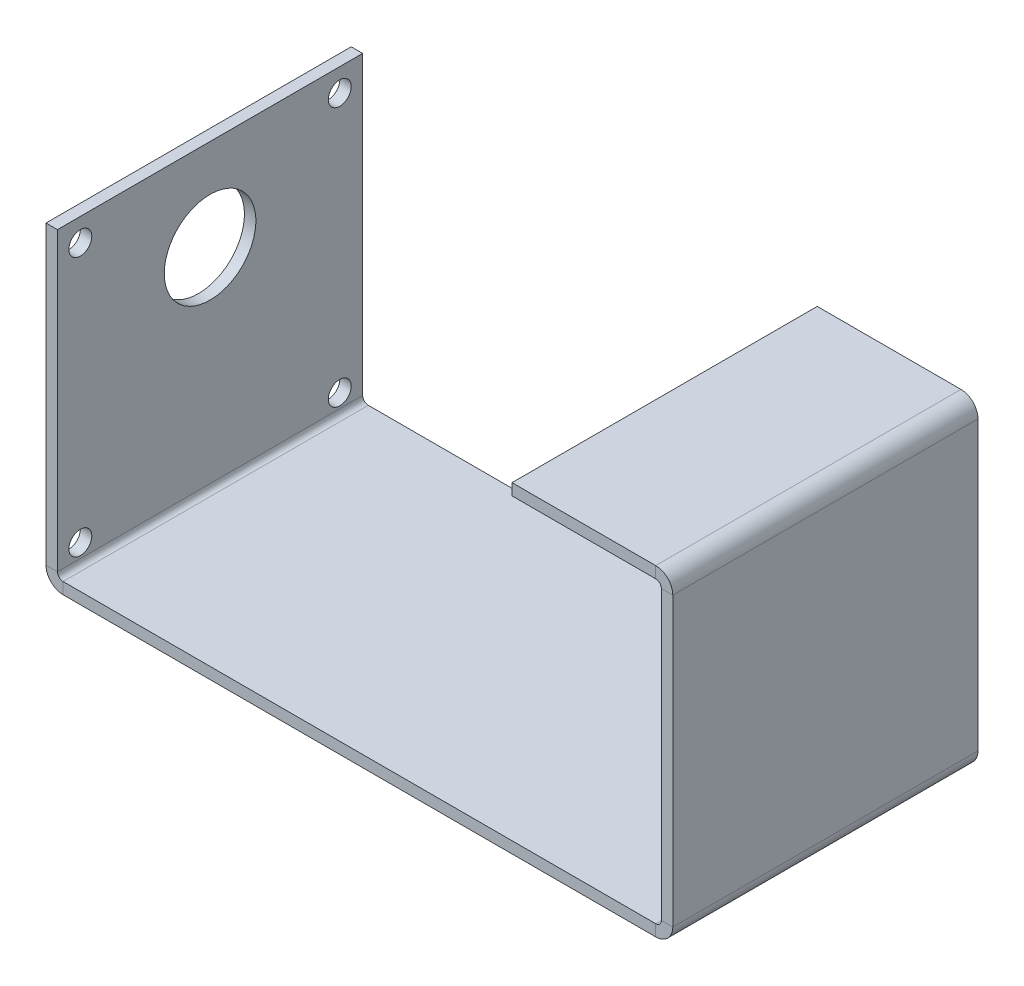
ISO-10303-21;
HEADER;
FILE_DESCRIPTION(('STEP AP214'),'2;1');
FILE_NAME('part.step','',(''),(''),'','','');
FILE_SCHEMA(('AUTOMOTIVE_DESIGN { 1 0 10303 214 1 1 1 1 }'));
ENDSEC;
DATA;
#1=APPLICATION_CONTEXT('core data for automotive mechanical design processes');
#2=APPLICATION_PROTOCOL_DEFINITION('international standard','automotive_design',2000,#1);
#3=PRODUCT_CONTEXT('',#1,'mechanical');
#4=PRODUCT('Part','Part','',(#3));
#5=PRODUCT_RELATED_PRODUCT_CATEGORY('part','',(#4));
#6=PRODUCT_DEFINITION_FORMATION('','',#4);
#7=PRODUCT_DEFINITION_CONTEXT('part definition',#1,'design');
#8=PRODUCT_DEFINITION('design','',#6,#7);
#9=PRODUCT_DEFINITION_SHAPE('','',#8);
#10=(LENGTH_UNIT() NAMED_UNIT(*) SI_UNIT(.MILLI.,.METRE.));
#11=(NAMED_UNIT(*) PLANE_ANGLE_UNIT() SI_UNIT($,.RADIAN.));
#12=(NAMED_UNIT(*) SI_UNIT($,.STERADIAN.) SOLID_ANGLE_UNIT());
#13=UNCERTAINTY_MEASURE_WITH_UNIT(LENGTH_MEASURE(1.E-05),#10,'distance_accuracy_value','');
#14=(GEOMETRIC_REPRESENTATION_CONTEXT(3) GLOBAL_UNCERTAINTY_ASSIGNED_CONTEXT((#13)) GLOBAL_UNIT_ASSIGNED_CONTEXT((#10,
#11,#12)) REPRESENTATION_CONTEXT('',''));
#15=CARTESIAN_POINT('',(0.,0.,0.));
#16=DIRECTION('',(0.,0.,1.));
#17=DIRECTION('',(1.,0.,0.));
#18=AXIS2_PLACEMENT_3D('',#15,#16,#17);
#19=CARTESIAN_POINT('',(121.069027090294,-120.430972909707,-40.));
#20=DIRECTION('',(0.,0.,-1.));
#21=DIRECTION('',(0.,-1.,0.));
#22=AXIS2_PLACEMENT_3D('',#19,#20,#21);
#23=PLANE('',#22);
#24=DIRECTION('',(0.,-1.,0.));
#25=VECTOR('',#24,1.);
#26=CARTESIAN_POINT('',(119.569027090294,-120.430972909707,-40.));
#27=LINE('',#26,#25);
#28=CARTESIAN_POINT('',(119.569027090293,38.4014541805867,-40.));
#29=VERTEX_POINT('',#28);
#30=CARTESIAN_POINT('',(119.569027090293,0.736600000000004,-40.));
#31=VERTEX_POINT('',#30);
#32=EDGE_CURVE('E75',#29,#31,#27,.T.);
#33=ORIENTED_EDGE('',*,*,#32,.F.);
#34=DIRECTION('',(1.,0.,0.));
#35=VECTOR('',#34,1.);
#36=CARTESIAN_POINT('',(121.069027090293,38.4014541805867,-40.));
#37=LINE('',#36,#35);
#38=CARTESIAN_POINT('',(121.069027090293,38.4014541805867,-40.));
#39=VERTEX_POINT('',#38);
#40=EDGE_CURVE('E345',#29,#39,#37,.T.);
#41=ORIENTED_EDGE('',*,*,#40,.T.);
#42=DIRECTION('',(0.,-1.,0.));
#43=VECTOR('',#42,1.);
#44=CARTESIAN_POINT('',(121.069027090293,39.5690270902934,-40.));
#45=LINE('',#44,#43);
#46=CARTESIAN_POINT('',(121.069027090293,0.736600000000004,-40.));
#47=VERTEX_POINT('',#46);
#48=EDGE_CURVE('E54',#39,#47,#45,.T.);
#49=ORIENTED_EDGE('',*,*,#48,.T.);
#50=DIRECTION('',(1.,0.,0.));
#51=VECTOR('',#50,1.);
#52=CARTESIAN_POINT('',(121.069027090293,0.736600000000004,-40.));
#53=LINE('',#52,#51);
#54=EDGE_CURVE('E339',#31,#47,#53,.T.);
#55=ORIENTED_EDGE('',*,*,#54,.F.);
#56=EDGE_LOOP('',(#33,#41,#49,#55));
#57=FACE_BOUND('',#56,.T.);
#58=ADVANCED_FACE('F50',(#57),#23,.T.);
#59=CARTESIAN_POINT('',(121.069027090293,39.5690270902934,0.));
#60=DIRECTION('',(0.,0.,1.));
#61=DIRECTION('',(0.,1.,0.));
#62=AXIS2_PLACEMENT_3D('',#59,#60,#61);
#63=PLANE('',#62);
#64=DIRECTION('',(0.,1.,0.));
#65=VECTOR('',#64,1.);
#66=CARTESIAN_POINT('',(121.069027090294,-120.430972909707,0.));
#67=LINE('',#66,#65);
#68=CARTESIAN_POINT('',(121.069027090293,0.736600000000007,0.));
#69=VERTEX_POINT('',#68);
#70=CARTESIAN_POINT('',(121.069027090293,38.4014541805867,0.));
#71=VERTEX_POINT('',#70);
#72=EDGE_CURVE('E349',#69,#71,#67,.T.);
#73=ORIENTED_EDGE('',*,*,#72,.T.);
#74=DIRECTION('',(-1.,0.,0.));
#75=VECTOR('',#74,1.);
#76=CARTESIAN_POINT('',(121.069027090293,38.4014541805867,0.));
#77=LINE('',#76,#75);
#78=CARTESIAN_POINT('',(119.569027090293,38.4014541805867,0.));
#79=VERTEX_POINT('',#78);
#80=EDGE_CURVE('E12',#71,#79,#77,.T.);
#81=ORIENTED_EDGE('',*,*,#80,.T.);
#82=DIRECTION('',(0.,1.,0.));
#83=VECTOR('',#82,1.);
#84=CARTESIAN_POINT('',(119.569027090293,39.5690270902934,0.));
#85=LINE('',#84,#83);
#86=CARTESIAN_POINT('',(119.569027090293,0.736600000000004,0.));
#87=VERTEX_POINT('',#86);
#88=EDGE_CURVE('E226',#87,#79,#85,.T.);
#89=ORIENTED_EDGE('',*,*,#88,.F.);
#90=DIRECTION('',(-1.,0.,0.));
#91=VECTOR('',#90,1.);
#92=CARTESIAN_POINT('',(121.069027090293,0.736600000000004,0.));
#93=LINE('',#92,#91);
#94=EDGE_CURVE('E334',#69,#87,#93,.T.);
#95=ORIENTED_EDGE('',*,*,#94,.F.);
#96=EDGE_LOOP('',(#73,#81,#89,#95));
#97=FACE_BOUND('',#96,.T.);
#98=ADVANCED_FACE('F52',(#97),#63,.T.);
#99=CARTESIAN_POINT('',(121.069027090294,-120.430972909707,0.));
#100=DIRECTION('',(1.,0.,0.));
#101=DIRECTION('',(0.,0.,-1.));
#102=AXIS2_PLACEMENT_3D('',#99,#100,#101);
#103=PLANE('',#102);
#104=ORIENTED_EDGE('',*,*,#48,.F.);
#105=DIRECTION('',(0.,0.,1.));
#106=VECTOR('',#105,1.);
#107=CARTESIAN_POINT('',(121.069027090293,38.4014541805867,0.));
#108=LINE('',#107,#106);
#109=EDGE_CURVE('E342',#39,#71,#108,.T.);
#110=ORIENTED_EDGE('',*,*,#109,.T.);
#111=ORIENTED_EDGE('',*,*,#72,.F.);
#112=DIRECTION('',(0.,0.,1.));
#113=VECTOR('',#112,1.);
#114=CARTESIAN_POINT('',(121.069027090293,0.736600000000004,0.));
#115=LINE('',#114,#113);
#116=EDGE_CURVE('E331',#47,#69,#115,.T.);
#117=ORIENTED_EDGE('',*,*,#116,.F.);
#118=EDGE_LOOP('',(#104,#110,#111,#117));
#119=FACE_BOUND('',#118,.T.);
#120=ADVANCED_FACE('F364',(#119),#103,.T.);
#121=CARTESIAN_POINT('',(119.569027090294,-120.430972909707,0.));
#122=DIRECTION('',(1.,0.,0.));
#123=DIRECTION('',(0.,0.,-1.));
#124=AXIS2_PLACEMENT_3D('',#121,#122,#123);
#125=PLANE('',#124);
#126=DIRECTION('',(0.,0.,1.));
#127=VECTOR('',#126,1.);
#128=CARTESIAN_POINT('',(119.569027090293,38.4014541805867,0.));
#129=LINE('',#128,#127);
#130=EDGE_CURVE('E59',#29,#79,#129,.T.);
#131=ORIENTED_EDGE('',*,*,#130,.F.);
#132=ORIENTED_EDGE('',*,*,#32,.T.);
#133=DIRECTION('',(0.,0.,1.));
#134=VECTOR('',#133,1.);
#135=CARTESIAN_POINT('',(119.569027090293,0.736600000000004,0.));
#136=LINE('',#135,#134);
#137=EDGE_CURVE('E337',#31,#87,#136,.T.);
#138=ORIENTED_EDGE('',*,*,#137,.T.);
#139=ORIENTED_EDGE('',*,*,#88,.T.);
#140=EDGE_LOOP('',(#131,#132,#138,#139));
#141=FACE_BOUND('',#140,.T.);
#142=ADVANCED_FACE('F353',(#141),#125,.F.);
#143=CARTESIAN_POINT('',(38.9309729097068,39.5690270902934,0.));
#144=DIRECTION('',(0.,1.,0.));
#145=DIRECTION('',(0.,0.,1.));
#146=AXIS2_PLACEMENT_3D('',#143,#144,#145);
#147=PLANE('',#146);
#148=DIRECTION('',(0.,0.,1.));
#149=VECTOR('',#148,1.);
#150=CARTESIAN_POINT('',(40.4309729097068,39.5690270902934,0.));
#151=LINE('',#150,#149);
#152=CARTESIAN_POINT('',(40.4309729097068,39.5690270902934,-40.));
#153=VERTEX_POINT('',#152);
#154=CARTESIAN_POINT('',(40.4309729097068,39.5690270902934,0.));
#155=VERTEX_POINT('',#154);
#156=EDGE_CURVE('E296',#153,#155,#151,.T.);
#157=ORIENTED_EDGE('',*,*,#156,.F.);
#158=DIRECTION('',(1.,0.,0.));
#159=VECTOR('',#158,1.);
#160=CARTESIAN_POINT('',(38.9309729097068,39.5690270902934,-40.));
#161=LINE('',#160,#159);
#162=CARTESIAN_POINT('',(38.9309729097068,39.5690270902934,-40.));
#163=VERTEX_POINT('',#162);
#164=EDGE_CURVE('E301',#163,#153,#161,.T.);
#165=ORIENTED_EDGE('',*,*,#164,.F.);
#166=DIRECTION('',(0.,0.,1.));
#167=VECTOR('',#166,1.);
#168=CARTESIAN_POINT('',(38.9309729097068,39.5690270902934,0.));
#169=LINE('',#168,#167);
#170=CARTESIAN_POINT('',(38.9309729097068,39.5690270902934,0.));
#171=VERTEX_POINT('',#170);
#172=EDGE_CURVE('E326',#163,#171,#169,.T.);
#173=ORIENTED_EDGE('',*,*,#172,.T.);
#174=DIRECTION('',(1.,0.,0.));
#175=VECTOR('',#174,1.);
#176=CARTESIAN_POINT('',(38.9309729097068,39.5690270902934,0.));
#177=LINE('',#176,#175);
#178=EDGE_CURVE('E323',#171,#155,#177,.T.);
#179=ORIENTED_EDGE('',*,*,#178,.T.);
#180=EDGE_LOOP('',(#157,#165,#173,#179));
#181=FACE_BOUND('',#180,.T.);
#182=ADVANCED_FACE('F402',(#181),#147,.T.);
#183=CARTESIAN_POINT('',(38.9309729097067,27.5690270902934,-20.));
#184=DIRECTION('',(1.,0.,0.));
#185=DIRECTION('',(0.,0.,1.));
#186=AXIS2_PLACEMENT_3D('',#183,#184,#185);
#187=CYLINDRICAL_SURFACE('',#186,5.99999999999999);
#188=CARTESIAN_POINT('',(38.9309729097067,27.5690270902934,-20.));
#189=DIRECTION('',(1.,0.,0.));
#190=DIRECTION('',(0.,0.,1.));
#191=AXIS2_PLACEMENT_3D('',#188,#189,#190);
#192=CIRCLE('',#191,5.99999999999999);
#193=CARTESIAN_POINT('',(38.9309729097067,27.5690270902934,-14.));
#194=VERTEX_POINT('',#193);
#195=EDGE_CURVE('E273',#194,#194,#192,.T.);
#196=ORIENTED_EDGE('',*,*,#195,.F.);
#197=EDGE_LOOP('',(#196));
#198=FACE_BOUND('',#197,.T.);
#199=CARTESIAN_POINT('',(40.4309729097068,27.5690270902934,-20.));
#200=DIRECTION('',(1.,0.,0.));
#201=DIRECTION('',(0.,0.,1.));
#202=AXIS2_PLACEMENT_3D('',#199,#200,#201);
#203=CIRCLE('',#202,5.99999999999999);
#204=CARTESIAN_POINT('',(40.4309729097068,27.5690270902934,-14.));
#205=VERTEX_POINT('',#204);
#206=EDGE_CURVE('E320',#205,#205,#203,.T.);
#207=ORIENTED_EDGE('',*,*,#206,.T.);
#208=EDGE_LOOP('',(#207));
#209=FACE_BOUND('',#208,.T.);
#210=ADVANCED_FACE('F407',(#198,#209),#187,.F.);
#211=CARTESIAN_POINT('',(38.9309729097068,36.5690270902934,-37.));
#212=DIRECTION('',(1.,0.,0.));
#213=DIRECTION('',(0.,0.,1.));
#214=AXIS2_PLACEMENT_3D('',#211,#212,#213);
#215=CYLINDRICAL_SURFACE('',#214,1.5);
#216=CARTESIAN_POINT('',(38.9309729097068,36.5690270902934,-37.));
#217=DIRECTION('',(1.,0.,0.));
#218=DIRECTION('',(0.,0.,1.));
#219=AXIS2_PLACEMENT_3D('',#216,#217,#218);
#220=CIRCLE('',#219,1.5);
#221=CARTESIAN_POINT('',(38.9309729097068,36.5690270902934,-35.5));
#222=VERTEX_POINT('',#221);
#223=EDGE_CURVE('E276',#222,#222,#220,.T.);
#224=ORIENTED_EDGE('',*,*,#223,.F.);
#225=EDGE_LOOP('',(#224));
#226=FACE_BOUND('',#225,.T.);
#227=CARTESIAN_POINT('',(40.4309729097068,36.5690270902934,-37.));
#228=DIRECTION('',(1.,0.,0.));
#229=DIRECTION('',(0.,0.,1.));
#230=AXIS2_PLACEMENT_3D('',#227,#228,#229);
#231=CIRCLE('',#230,1.5);
#232=CARTESIAN_POINT('',(40.4309729097068,36.5690270902934,-35.5));
#233=VERTEX_POINT('',#232);
#234=EDGE_CURVE('E317',#233,#233,#231,.T.);
#235=ORIENTED_EDGE('',*,*,#234,.T.);
#236=EDGE_LOOP('',(#235));
#237=FACE_BOUND('',#236,.T.);
#238=ADVANCED_FACE('F445',(#226,#237),#215,.F.);
#239=CARTESIAN_POINT('',(38.9309729097067,2.56902709029332,-37.0000000000004));
#240=DIRECTION('',(1.,0.,0.));
#241=DIRECTION('',(0.,0.,1.));
#242=AXIS2_PLACEMENT_3D('',#239,#240,#241);
#243=CYLINDRICAL_SURFACE('',#242,1.5);
#244=CARTESIAN_POINT('',(38.9309729097067,2.56902709029332,-37.0000000000004));
#245=DIRECTION('',(1.,0.,0.));
#246=DIRECTION('',(0.,0.,1.));
#247=AXIS2_PLACEMENT_3D('',#244,#245,#246);
#248=CIRCLE('',#247,1.5);
#249=CARTESIAN_POINT('',(38.9309729097067,2.56902709029332,-35.5000000000004));
#250=VERTEX_POINT('',#249);
#251=EDGE_CURVE('E279',#250,#250,#248,.T.);
#252=ORIENTED_EDGE('',*,*,#251,.F.);
#253=EDGE_LOOP('',(#252));
#254=FACE_BOUND('',#253,.T.);
#255=CARTESIAN_POINT('',(40.4309729097067,2.56902709029331,-37.0000000000004));
#256=DIRECTION('',(1.,0.,0.));
#257=DIRECTION('',(0.,0.,1.));
#258=AXIS2_PLACEMENT_3D('',#255,#256,#257);
#259=CIRCLE('',#258,1.5);
#260=CARTESIAN_POINT('',(40.4309729097067,2.56902709029331,-35.5000000000004));
#261=VERTEX_POINT('',#260);
#262=EDGE_CURVE('E314',#261,#261,#259,.T.);
#263=ORIENTED_EDGE('',*,*,#262,.T.);
#264=EDGE_LOOP('',(#263));
#265=FACE_BOUND('',#264,.T.);
#266=ADVANCED_FACE('F456',(#254,#265),#243,.F.);
#267=CARTESIAN_POINT('',(38.9309729097067,2.56902709029301,-3.00000000000036));
#268=DIRECTION('',(1.,0.,0.));
#269=DIRECTION('',(0.,0.,1.));
#270=AXIS2_PLACEMENT_3D('',#267,#268,#269);
#271=CYLINDRICAL_SURFACE('',#270,1.5);
#272=CARTESIAN_POINT('',(38.9309729097067,2.56902709029301,-3.00000000000036));
#273=DIRECTION('',(1.,0.,0.));
#274=DIRECTION('',(0.,0.,1.));
#275=AXIS2_PLACEMENT_3D('',#272,#273,#274);
#276=CIRCLE('',#275,1.5);
#277=CARTESIAN_POINT('',(38.9309729097067,2.56902709029301,-1.50000000000035));
#278=VERTEX_POINT('',#277);
#279=EDGE_CURVE('E282',#278,#278,#276,.T.);
#280=ORIENTED_EDGE('',*,*,#279,.F.);
#281=EDGE_LOOP('',(#280));
#282=FACE_BOUND('',#281,.T.);
#283=CARTESIAN_POINT('',(40.4309729097067,2.569027090293,-3.00000000000036));
#284=DIRECTION('',(1.,0.,0.));
#285=DIRECTION('',(0.,0.,1.));
#286=AXIS2_PLACEMENT_3D('',#283,#284,#285);
#287=CIRCLE('',#286,1.5);
#288=CARTESIAN_POINT('',(40.4309729097067,2.569027090293,-1.50000000000035));
#289=VERTEX_POINT('',#288);
#290=EDGE_CURVE('E311',#289,#289,#287,.T.);
#291=ORIENTED_EDGE('',*,*,#290,.T.);
#292=EDGE_LOOP('',(#291));
#293=FACE_BOUND('',#292,.T.);
#294=ADVANCED_FACE('F467',(#282,#293),#271,.F.);
#295=CARTESIAN_POINT('',(38.9309729097068,36.5690270902931,-3.00000000000018));
#296=DIRECTION('',(1.,0.,0.));
#297=DIRECTION('',(0.,0.,1.));
#298=AXIS2_PLACEMENT_3D('',#295,#296,#297);
#299=CYLINDRICAL_SURFACE('',#298,1.5);
#300=CARTESIAN_POINT('',(38.9309729097068,36.5690270902931,-3.00000000000018));
#301=DIRECTION('',(1.,0.,0.));
#302=DIRECTION('',(0.,0.,1.));
#303=AXIS2_PLACEMENT_3D('',#300,#301,#302);
#304=CIRCLE('',#303,1.5);
#305=CARTESIAN_POINT('',(38.9309729097068,36.5690270902931,-1.50000000000018));
#306=VERTEX_POINT('',#305);
#307=EDGE_CURVE('E285',#306,#306,#304,.T.);
#308=ORIENTED_EDGE('',*,*,#307,.F.);
#309=EDGE_LOOP('',(#308));
#310=FACE_BOUND('',#309,.T.);
#311=CARTESIAN_POINT('',(40.4309729097068,36.5690270902931,-3.00000000000018));
#312=DIRECTION('',(1.,0.,0.));
#313=DIRECTION('',(0.,0.,1.));
#314=AXIS2_PLACEMENT_3D('',#311,#312,#313);
#315=CIRCLE('',#314,1.5);
#316=CARTESIAN_POINT('',(40.4309729097068,36.5690270902931,-1.50000000000018));
#317=VERTEX_POINT('',#316);
#318=EDGE_CURVE('E308',#317,#317,#315,.T.);
#319=ORIENTED_EDGE('',*,*,#318,.T.);
#320=EDGE_LOOP('',(#319));
#321=FACE_BOUND('',#320,.T.);
#322=ADVANCED_FACE('F478',(#310,#321),#299,.F.);
#323=CARTESIAN_POINT('',(38.9309729097068,39.5690270902934,-40.));
#324=DIRECTION('',(0.,0.,-1.));
#325=DIRECTION('',(0.,1.,0.));
#326=AXIS2_PLACEMENT_3D('',#323,#324,#325);
#327=PLANE('',#326);
#328=DIRECTION('',(0.,1.,0.));
#329=VECTOR('',#328,1.);
#330=CARTESIAN_POINT('',(40.4309729097068,39.5690270902934,-40.));
#331=LINE('',#330,#329);
#332=CARTESIAN_POINT('',(40.4309729097067,0.736600000000004,-40.));
#333=VERTEX_POINT('',#332);
#334=EDGE_CURVE('E299',#333,#153,#331,.T.);
#335=ORIENTED_EDGE('',*,*,#334,.F.);
#336=DIRECTION('',(-1.,0.,0.));
#337=VECTOR('',#336,1.);
#338=CARTESIAN_POINT('',(38.9309729097067,0.736600000000011,-40.));
#339=LINE('',#338,#337);
#340=CARTESIAN_POINT('',(38.9309729097067,0.736600000000007,-40.));
#341=VERTEX_POINT('',#340);
#342=EDGE_CURVE('E306',#333,#341,#339,.T.);
#343=ORIENTED_EDGE('',*,*,#342,.T.);
#344=DIRECTION('',(0.,1.,0.));
#345=VECTOR('',#344,1.);
#346=CARTESIAN_POINT('',(38.9309729097062,-120.430972909707,-40.));
#347=LINE('',#346,#345);
#348=EDGE_CURVE('E304',#341,#163,#347,.T.);
#349=ORIENTED_EDGE('',*,*,#348,.T.);
#350=ORIENTED_EDGE('',*,*,#164,.T.);
#351=EDGE_LOOP('',(#335,#343,#349,#350));
#352=FACE_BOUND('',#351,.T.);
#353=ADVANCED_FACE('F489',(#352),#327,.T.);
#354=CARTESIAN_POINT('',(40.4309729097068,39.5690270902934,0.));
#355=DIRECTION('',(-1.,0.,0.));
#356=DIRECTION('',(0.,0.,-1.));
#357=AXIS2_PLACEMENT_3D('',#354,#355,#356);
#358=PLANE('',#357);
#359=DIRECTION('',(0.,0.,1.));
#360=VECTOR('',#359,1.);
#361=CARTESIAN_POINT('',(40.4309729097067,0.736600000000004,0.));
#362=LINE('',#361,#360);
#363=CARTESIAN_POINT('',(40.4309729097067,0.736600000000004,0.));
#364=VERTEX_POINT('',#363);
#365=EDGE_CURVE('E262',#333,#364,#362,.T.);
#366=ORIENTED_EDGE('',*,*,#365,.F.);
#367=ORIENTED_EDGE('',*,*,#334,.T.);
#368=ORIENTED_EDGE('',*,*,#156,.T.);
#369=DIRECTION('',(0.,-1.,0.));
#370=VECTOR('',#369,1.);
#371=CARTESIAN_POINT('',(40.4309729097062,-120.430972909707,0.));
#372=LINE('',#371,#370);
#373=EDGE_CURVE('E294',#155,#364,#372,.T.);
#374=ORIENTED_EDGE('',*,*,#373,.T.);
#375=EDGE_LOOP('',(#366,#367,#368,#374));
#376=FACE_BOUND('',#375,.T.);
#377=ORIENTED_EDGE('',*,*,#318,.F.);
#378=EDGE_LOOP('',(#377));
#379=FACE_BOUND('',#378,.T.);
#380=ORIENTED_EDGE('',*,*,#290,.F.);
#381=EDGE_LOOP('',(#380));
#382=FACE_BOUND('',#381,.T.);
#383=ORIENTED_EDGE('',*,*,#262,.F.);
#384=EDGE_LOOP('',(#383));
#385=FACE_BOUND('',#384,.T.);
#386=ORIENTED_EDGE('',*,*,#234,.F.);
#387=EDGE_LOOP('',(#386));
#388=FACE_BOUND('',#387,.T.);
#389=ORIENTED_EDGE('',*,*,#206,.F.);
#390=EDGE_LOOP('',(#389));
#391=FACE_BOUND('',#390,.T.);
#392=ADVANCED_FACE('F500',(#376,#379,#382,#385,#388,#391),#358,.F.);
#393=CARTESIAN_POINT('',(38.9309729097062,-120.430972909707,0.));
#394=DIRECTION('',(0.,0.,1.));
#395=DIRECTION('',(0.,-1.,0.));
#396=AXIS2_PLACEMENT_3D('',#393,#394,#395);
#397=PLANE('',#396);
#398=DIRECTION('',(0.,-1.,0.));
#399=VECTOR('',#398,1.);
#400=CARTESIAN_POINT('',(38.9309729097068,39.5690270902934,0.));
#401=LINE('',#400,#399);
#402=CARTESIAN_POINT('',(38.9309729097067,0.736600000000011,0.));
#403=VERTEX_POINT('',#402);
#404=EDGE_CURVE('E291',#171,#403,#401,.T.);
#405=ORIENTED_EDGE('',*,*,#404,.T.);
#406=DIRECTION('',(1.,0.,0.));
#407=VECTOR('',#406,1.);
#408=CARTESIAN_POINT('',(38.9309729097067,0.736600000000011,0.));
#409=LINE('',#408,#407);
#410=EDGE_CURVE('E288',#403,#364,#409,.T.);
#411=ORIENTED_EDGE('',*,*,#410,.T.);
#412=ORIENTED_EDGE('',*,*,#373,.F.);
#413=ORIENTED_EDGE('',*,*,#178,.F.);
#414=EDGE_LOOP('',(#405,#411,#412,#413));
#415=FACE_BOUND('',#414,.T.);
#416=ADVANCED_FACE('F513',(#415),#397,.T.);
#417=CARTESIAN_POINT('',(38.9309729097068,39.5690270902934,0.));
#418=DIRECTION('',(-1.,0.,0.));
#419=DIRECTION('',(0.,0.,-1.));
#420=AXIS2_PLACEMENT_3D('',#417,#418,#419);
#421=PLANE('',#420);
#422=ORIENTED_EDGE('',*,*,#307,.T.);
#423=EDGE_LOOP('',(#422));
#424=FACE_BOUND('',#423,.T.);
#425=ORIENTED_EDGE('',*,*,#279,.T.);
#426=EDGE_LOOP('',(#425));
#427=FACE_BOUND('',#426,.T.);
#428=ORIENTED_EDGE('',*,*,#251,.T.);
#429=EDGE_LOOP('',(#428));
#430=FACE_BOUND('',#429,.T.);
#431=ORIENTED_EDGE('',*,*,#223,.T.);
#432=EDGE_LOOP('',(#431));
#433=FACE_BOUND('',#432,.T.);
#434=ORIENTED_EDGE('',*,*,#195,.T.);
#435=EDGE_LOOP('',(#434));
#436=FACE_BOUND('',#435,.T.);
#437=ORIENTED_EDGE('',*,*,#348,.F.);
#438=DIRECTION('',(0.,0.,1.));
#439=VECTOR('',#438,1.);
#440=CARTESIAN_POINT('',(38.9309729097067,0.736600000000011,0.));
#441=LINE('',#440,#439);
#442=EDGE_CURVE('E271',#341,#403,#441,.T.);
#443=ORIENTED_EDGE('',*,*,#442,.T.);
#444=ORIENTED_EDGE('',*,*,#404,.F.);
#445=ORIENTED_EDGE('',*,*,#172,.F.);
#446=EDGE_LOOP('',(#437,#443,#444,#445));
#447=FACE_BOUND('',#446,.T.);
#448=ADVANCED_FACE('F526',(#424,#427,#430,#433,#436,#447),#421,.T.);
#449=CARTESIAN_POINT('',(41.1675729097067,0.7366,-40.));
#450=DIRECTION('',(0.,0.,-1.));
#451=DIRECTION('',(-1.,0.,0.));
#452=AXIS2_PLACEMENT_3D('',#449,#450,#451);
#453=PLANE('',#452);
#454=ORIENTED_EDGE('',*,*,#342,.F.);
#455=CARTESIAN_POINT('',(41.1675729097067,0.7366,-40.));
#456=DIRECTION('',(0.,0.,-1.));
#457=DIRECTION('',(-1.,0.,0.));
#458=AXIS2_PLACEMENT_3D('',#455,#456,#457);
#459=CIRCLE('',#458,0.7366);
#460=CARTESIAN_POINT('',(41.1675729097067,0.,-40.));
#461=VERTEX_POINT('',#460);
#462=EDGE_CURVE('E268',#333,#461,#459,.F.);
#463=ORIENTED_EDGE('',*,*,#462,.T.);
#464=DIRECTION('',(0.,-1.,0.));
#465=VECTOR('',#464,1.);
#466=CARTESIAN_POINT('',(41.1675729097067,-1.5,-40.));
#467=LINE('',#466,#465);
#468=CARTESIAN_POINT('',(41.1675729097067,-1.5,-40.));
#469=VERTEX_POINT('',#468);
#470=EDGE_CURVE('E265',#461,#469,#467,.T.);
#471=ORIENTED_EDGE('',*,*,#470,.T.);
#472=CARTESIAN_POINT('',(41.1675729097067,0.7366,-40.));
#473=DIRECTION('',(0.,0.,1.));
#474=DIRECTION('',(-1.,0.,0.));
#475=AXIS2_PLACEMENT_3D('',#472,#473,#474);
#476=CIRCLE('',#475,2.2366);
#477=EDGE_CURVE('E247',#341,#469,#476,.T.);
#478=ORIENTED_EDGE('',*,*,#477,.F.);
#479=EDGE_LOOP('',(#454,#463,#471,#478));
#480=FACE_BOUND('',#479,.T.);
#481=ADVANCED_FACE('F537',(#480),#453,.T.);
#482=CARTESIAN_POINT('',(41.1675729097067,0.7366,20.096170714894));
#483=DIRECTION('',(0.,0.,-1.));
#484=DIRECTION('',(-1.,0.,0.));
#485=AXIS2_PLACEMENT_3D('',#482,#483,#484);
#486=CYLINDRICAL_SURFACE('',#485,0.7366);
#487=DIRECTION('',(0.,0.,1.));
#488=VECTOR('',#487,1.);
#489=CARTESIAN_POINT('',(41.1675729097067,0.,0.));
#490=LINE('',#489,#488);
#491=CARTESIAN_POINT('',(41.1675729097067,0.,0.));
#492=VERTEX_POINT('',#491);
#493=EDGE_CURVE('E233',#461,#492,#490,.T.);
#494=ORIENTED_EDGE('',*,*,#493,.F.);
#495=ORIENTED_EDGE('',*,*,#462,.F.);
#496=ORIENTED_EDGE('',*,*,#365,.T.);
#497=CARTESIAN_POINT('',(41.1675729097067,0.7366,0.));
#498=DIRECTION('',(0.,0.,-1.));
#499=DIRECTION('',(-1.,0.,0.));
#500=AXIS2_PLACEMENT_3D('',#497,#498,#499);
#501=CIRCLE('',#500,0.7366);
#502=EDGE_CURVE('E259',#492,#364,#501,.T.);
#503=ORIENTED_EDGE('',*,*,#502,.F.);
#504=EDGE_LOOP('',(#494,#495,#496,#503));
#505=FACE_BOUND('',#504,.T.);
#506=ADVANCED_FACE('F548',(#505),#486,.F.);
#507=CARTESIAN_POINT('',(41.1675729097067,0.7366,0.));
#508=DIRECTION('',(0.,0.,1.));
#509=DIRECTION('',(1.,0.,0.));
#510=AXIS2_PLACEMENT_3D('',#507,#508,#509);
#511=PLANE('',#510);
#512=ORIENTED_EDGE('',*,*,#502,.T.);
#513=ORIENTED_EDGE('',*,*,#410,.F.);
#514=CARTESIAN_POINT('',(41.1675729097067,0.7366,0.));
#515=DIRECTION('',(0.,0.,-1.));
#516=DIRECTION('',(1.,0.,0.));
#517=AXIS2_PLACEMENT_3D('',#514,#515,#516);
#518=CIRCLE('',#517,2.2366);
#519=CARTESIAN_POINT('',(41.1675729097067,-1.5,0.));
#520=VERTEX_POINT('',#519);
#521=EDGE_CURVE('E250',#520,#403,#518,.T.);
#522=ORIENTED_EDGE('',*,*,#521,.F.);
#523=DIRECTION('',(0.,1.,0.));
#524=VECTOR('',#523,1.);
#525=CARTESIAN_POINT('',(41.1675729097067,-1.5,0.));
#526=LINE('',#525,#524);
#527=EDGE_CURVE('E256',#520,#492,#526,.T.);
#528=ORIENTED_EDGE('',*,*,#527,.T.);
#529=EDGE_LOOP('',(#512,#513,#522,#528));
#530=FACE_BOUND('',#529,.T.);
#531=ADVANCED_FACE('F559',(#530),#511,.T.);
#532=CARTESIAN_POINT('',(41.1675729097067,0.7366,20.096170714894));
#533=DIRECTION('',(0.,0.,-1.));
#534=DIRECTION('',(-1.,0.,0.));
#535=AXIS2_PLACEMENT_3D('',#532,#533,#534);
#536=CYLINDRICAL_SURFACE('',#535,2.2366);
#537=DIRECTION('',(0.,0.,1.));
#538=VECTOR('',#537,1.);
#539=CARTESIAN_POINT('',(41.1675729097067,-1.5,0.));
#540=LINE('',#539,#538);
#541=EDGE_CURVE('E253',#469,#520,#540,.T.);
#542=ORIENTED_EDGE('',*,*,#541,.T.);
#543=ORIENTED_EDGE('',*,*,#521,.T.);
#544=ORIENTED_EDGE('',*,*,#442,.F.);
#545=ORIENTED_EDGE('',*,*,#477,.T.);
#546=EDGE_LOOP('',(#542,#543,#544,#545));
#547=FACE_BOUND('',#546,.T.);
#548=ADVANCED_FACE('F570',(#547),#536,.T.);
#549=CARTESIAN_POINT('',(0.,-1.5,0.));
#550=DIRECTION('',(0.,-1.,0.));
#551=DIRECTION('',(0.,0.,-1.));
#552=AXIS2_PLACEMENT_3D('',#549,#550,#551);
#553=PLANE('',#552);
#554=DIRECTION('',(-1.,0.,0.));
#555=VECTOR('',#554,1.);
#556=CARTESIAN_POINT('',(160.,-1.5,-40.));
#557=LINE('',#556,#555);
#558=CARTESIAN_POINT('',(118.832427090293,-1.5,-40.));
#559=VERTEX_POINT('',#558);
#560=EDGE_CURVE('E223',#559,#469,#557,.T.);
#561=ORIENTED_EDGE('',*,*,#560,.F.);
#562=DIRECTION('',(0.,0.,1.));
#563=VECTOR('',#562,1.);
#564=CARTESIAN_POINT('',(118.832427090293,-1.5,0.));
#565=LINE('',#564,#563);
#566=CARTESIAN_POINT('',(118.832427090293,-1.5,0.));
#567=VERTEX_POINT('',#566);
#568=EDGE_CURVE('E244',#559,#567,#565,.T.);
#569=ORIENTED_EDGE('',*,*,#568,.T.);
#570=DIRECTION('',(1.,0.,0.));
#571=VECTOR('',#570,1.);
#572=CARTESIAN_POINT('',(0.,-1.5,0.));
#573=LINE('',#572,#571);
#574=EDGE_CURVE('E241',#520,#567,#573,.T.);
#575=ORIENTED_EDGE('',*,*,#574,.F.);
#576=ORIENTED_EDGE('',*,*,#541,.F.);
#577=EDGE_LOOP('',(#561,#569,#575,#576));
#578=FACE_BOUND('',#577,.T.);
#579=ADVANCED_FACE('F581',(#578),#553,.T.);
#580=CARTESIAN_POINT('',(160.,-1.5,0.));
#581=DIRECTION('',(0.,0.,1.));
#582=DIRECTION('',(1.,0.,0.));
#583=AXIS2_PLACEMENT_3D('',#580,#581,#582);
#584=PLANE('',#583);
#585=ORIENTED_EDGE('',*,*,#574,.T.);
#586=DIRECTION('',(0.,1.,0.));
#587=VECTOR('',#586,1.);
#588=CARTESIAN_POINT('',(118.832427090293,-1.5,0.));
#589=LINE('',#588,#587);
#590=CARTESIAN_POINT('',(118.832427090293,0.,0.));
#591=VERTEX_POINT('',#590);
#592=EDGE_CURVE('E238',#567,#591,#589,.T.);
#593=ORIENTED_EDGE('',*,*,#592,.T.);
#594=DIRECTION('',(1.,0.,0.));
#595=VECTOR('',#594,1.);
#596=CARTESIAN_POINT('',(160.,0.,0.));
#597=LINE('',#596,#595);
#598=EDGE_CURVE('E230',#492,#591,#597,.T.);
#599=ORIENTED_EDGE('',*,*,#598,.F.);
#600=ORIENTED_EDGE('',*,*,#527,.F.);
#601=EDGE_LOOP('',(#585,#593,#599,#600));
#602=FACE_BOUND('',#601,.T.);
#603=ADVANCED_FACE('F593',(#602),#584,.T.);
#604=CARTESIAN_POINT('',(0.,0.,0.));
#605=DIRECTION('',(0.,-1.,0.));
#606=DIRECTION('',(0.,0.,-1.));
#607=AXIS2_PLACEMENT_3D('',#604,#605,#606);
#608=PLANE('',#607);
#609=DIRECTION('',(0.,0.,1.));
#610=VECTOR('',#609,1.);
#611=CARTESIAN_POINT('',(118.832427090293,0.,0.));
#612=LINE('',#611,#610);
#613=CARTESIAN_POINT('',(118.832427090293,0.,-40.));
#614=VERTEX_POINT('',#613);
#615=EDGE_CURVE('E219',#614,#591,#612,.T.);
#616=ORIENTED_EDGE('',*,*,#615,.F.);
#617=DIRECTION('',(-1.,0.,0.));
#618=VECTOR('',#617,1.);
#619=CARTESIAN_POINT('',(0.,0.,-40.));
#620=LINE('',#619,#618);
#621=EDGE_CURVE('E236',#614,#461,#620,.T.);
#622=ORIENTED_EDGE('',*,*,#621,.T.);
#623=ORIENTED_EDGE('',*,*,#493,.T.);
#624=ORIENTED_EDGE('',*,*,#598,.T.);
#625=EDGE_LOOP('',(#616,#622,#623,#624));
#626=FACE_BOUND('',#625,.T.);
#627=ADVANCED_FACE('F605',(#626),#608,.F.);
#628=CARTESIAN_POINT('',(0.,-1.5,-40.));
#629=DIRECTION('',(0.,0.,-1.));
#630=DIRECTION('',(-1.,0.,0.));
#631=AXIS2_PLACEMENT_3D('',#628,#629,#630);
#632=PLANE('',#631);
#633=ORIENTED_EDGE('',*,*,#621,.F.);
#634=DIRECTION('',(0.,-1.,0.));
#635=VECTOR('',#634,1.);
#636=CARTESIAN_POINT('',(118.832427090293,-1.5,-40.));
#637=LINE('',#636,#635);
#638=EDGE_CURVE('E227',#614,#559,#637,.T.);
#639=ORIENTED_EDGE('',*,*,#638,.T.);
#640=ORIENTED_EDGE('',*,*,#560,.T.);
#641=ORIENTED_EDGE('',*,*,#470,.F.);
#642=EDGE_LOOP('',(#633,#639,#640,#641));
#643=FACE_BOUND('',#642,.T.);
#644=ADVANCED_FACE('F616',(#643),#632,.T.);
#645=CARTESIAN_POINT('',(118.832427090293,0.7366,-40.));
#646=DIRECTION('',(0.,0.,-1.));
#647=DIRECTION('',(-1.,0.,0.));
#648=AXIS2_PLACEMENT_3D('',#645,#646,#647);
#649=PLANE('',#648);
#650=ORIENTED_EDGE('',*,*,#638,.F.);
#651=CARTESIAN_POINT('',(118.832427090293,0.7366,-40.));
#652=DIRECTION('',(0.,0.,1.));
#653=DIRECTION('',(1.,0.,0.));
#654=AXIS2_PLACEMENT_3D('',#651,#652,#653);
#655=CIRCLE('',#654,0.7366);
#656=EDGE_CURVE('E208',#614,#31,#655,.T.);
#657=ORIENTED_EDGE('',*,*,#656,.T.);
#658=ORIENTED_EDGE('',*,*,#54,.T.);
#659=CARTESIAN_POINT('',(118.832427090293,0.7366,-40.));
#660=DIRECTION('',(0.,0.,1.));
#661=DIRECTION('',(-1.,0.,0.));
#662=AXIS2_PLACEMENT_3D('',#659,#660,#661);
#663=CIRCLE('',#662,2.2366);
#664=EDGE_CURVE('E212',#559,#47,#663,.T.);
#665=ORIENTED_EDGE('',*,*,#664,.F.);
#666=EDGE_LOOP('',(#650,#657,#658,#665));
#667=FACE_BOUND('',#666,.T.);
#668=ADVANCED_FACE('F628',(#667),#649,.T.);
#669=CARTESIAN_POINT('',(118.832427090293,0.7366,0.));
#670=DIRECTION('',(0.,0.,1.));
#671=DIRECTION('',(1.,0.,0.));
#672=AXIS2_PLACEMENT_3D('',#669,#670,#671);
#673=PLANE('',#672);
#674=CARTESIAN_POINT('',(118.832427090293,0.7366,0.));
#675=DIRECTION('',(0.,0.,1.));
#676=DIRECTION('',(1.,0.,0.));
#677=AXIS2_PLACEMENT_3D('',#674,#675,#676);
#678=CIRCLE('',#677,0.7366);
#679=EDGE_CURVE('E216',#87,#591,#678,.F.);
#680=ORIENTED_EDGE('',*,*,#679,.T.);
#681=ORIENTED_EDGE('',*,*,#592,.F.);
#682=CARTESIAN_POINT('',(118.832427090293,0.7366,0.));
#683=DIRECTION('',(0.,0.,-1.));
#684=DIRECTION('',(1.,0.,0.));
#685=AXIS2_PLACEMENT_3D('',#682,#683,#684);
#686=CIRCLE('',#685,2.2366);
#687=EDGE_CURVE('E215',#69,#567,#686,.T.);
#688=ORIENTED_EDGE('',*,*,#687,.F.);
#689=ORIENTED_EDGE('',*,*,#94,.T.);
#690=EDGE_LOOP('',(#680,#681,#688,#689));
#691=FACE_BOUND('',#690,.T.);
#692=ADVANCED_FACE('F637',(#691),#673,.T.);
#693=CARTESIAN_POINT('',(118.832427090293,0.7366,-60.096170714894));
#694=DIRECTION('',(0.,0.,1.));
#695=DIRECTION('',(1.,0.,0.));
#696=AXIS2_PLACEMENT_3D('',#693,#694,#695);
#697=CYLINDRICAL_SURFACE('',#696,2.2366);
#698=ORIENTED_EDGE('',*,*,#116,.T.);
#699=ORIENTED_EDGE('',*,*,#687,.T.);
#700=ORIENTED_EDGE('',*,*,#568,.F.);
#701=ORIENTED_EDGE('',*,*,#664,.T.);
#702=EDGE_LOOP('',(#698,#699,#700,#701));
#703=FACE_BOUND('',#702,.T.);
#704=ADVANCED_FACE('F648',(#703),#697,.T.);
#705=CARTESIAN_POINT('',(118.832427090293,0.7366,-60.096170714894));
#706=DIRECTION('',(0.,0.,1.));
#707=DIRECTION('',(1.,0.,0.));
#708=AXIS2_PLACEMENT_3D('',#705,#706,#707);
#709=CYLINDRICAL_SURFACE('',#708,0.7366);
#710=ORIENTED_EDGE('',*,*,#137,.F.);
#711=ORIENTED_EDGE('',*,*,#656,.F.);
#712=ORIENTED_EDGE('',*,*,#615,.T.);
#713=ORIENTED_EDGE('',*,*,#679,.F.);
#714=EDGE_LOOP('',(#710,#711,#712,#713));
#715=FACE_BOUND('',#714,.T.);
#716=ADVANCED_FACE('F659',(#715),#709,.F.);
#717=CARTESIAN_POINT('',(118.832427090293,38.4014541805867,-40.));
#718=DIRECTION('',(0.,0.,-1.));
#719=DIRECTION('',(-1.,0.,0.));
#720=AXIS2_PLACEMENT_3D('',#717,#718,#719);
#721=PLANE('',#720);
#722=ORIENTED_EDGE('',*,*,#40,.F.);
#723=CARTESIAN_POINT('',(118.832427090293,38.4014541805867,-40.));
#724=DIRECTION('',(0.,0.,1.));
#725=DIRECTION('',(1.,0.,0.));
#726=AXIS2_PLACEMENT_3D('',#723,#724,#725);
#727=CIRCLE('',#726,0.7366);
#728=CARTESIAN_POINT('',(118.832427090293,39.1380541805867,-40.));
#729=VERTEX_POINT('',#728);
#730=EDGE_CURVE('E185',#29,#729,#727,.T.);
#731=ORIENTED_EDGE('',*,*,#730,.T.);
#732=DIRECTION('',(0.,1.,0.));
#733=VECTOR('',#732,1.);
#734=CARTESIAN_POINT('',(118.832427090293,40.6380541805867,-40.));
#735=LINE('',#734,#733);
#736=CARTESIAN_POINT('',(118.832427090293,40.6380541805867,-40.));
#737=VERTEX_POINT('',#736);
#738=EDGE_CURVE('E192',#729,#737,#735,.T.);
#739=ORIENTED_EDGE('',*,*,#738,.T.);
#740=CARTESIAN_POINT('',(118.832427090293,38.4014541805867,-40.));
#741=DIRECTION('',(0.,0.,1.));
#742=DIRECTION('',(-1.,0.,0.));
#743=AXIS2_PLACEMENT_3D('',#740,#741,#742);
#744=CIRCLE('',#743,2.2366);
#745=EDGE_CURVE('E202',#39,#737,#744,.T.);
#746=ORIENTED_EDGE('',*,*,#745,.F.);
#747=EDGE_LOOP('',(#722,#731,#739,#746));
#748=FACE_BOUND('',#747,.T.);
#749=ADVANCED_FACE('F369',(#748),#721,.T.);
#750=CARTESIAN_POINT('',(118.832427090293,38.4014541805867,0.));
#751=DIRECTION('',(0.,0.,1.));
#752=DIRECTION('',(1.,0.,0.));
#753=AXIS2_PLACEMENT_3D('',#750,#751,#752);
#754=PLANE('',#753);
#755=CARTESIAN_POINT('',(118.832427090293,38.4014541805867,0.));
#756=DIRECTION('',(0.,0.,1.));
#757=DIRECTION('',(1.,0.,0.));
#758=AXIS2_PLACEMENT_3D('',#755,#756,#757);
#759=CIRCLE('',#758,0.7366);
#760=CARTESIAN_POINT('',(118.832427090293,39.1380541805867,0.));
#761=VERTEX_POINT('',#760);
#762=EDGE_CURVE('E67',#761,#79,#759,.F.);
#763=ORIENTED_EDGE('',*,*,#762,.T.);
#764=ORIENTED_EDGE('',*,*,#80,.F.);
#765=CARTESIAN_POINT('',(118.832427090293,38.4014541805867,0.));
#766=DIRECTION('',(0.,0.,-1.));
#767=DIRECTION('',(1.,0.,0.));
#768=AXIS2_PLACEMENT_3D('',#765,#766,#767);
#769=CIRCLE('',#768,2.2366);
#770=CARTESIAN_POINT('',(118.832427090293,40.6380541805867,0.));
#771=VERTEX_POINT('',#770);
#772=EDGE_CURVE('E205',#771,#71,#769,.T.);
#773=ORIENTED_EDGE('',*,*,#772,.F.);
#774=DIRECTION('',(0.,-1.,0.));
#775=VECTOR('',#774,1.);
#776=CARTESIAN_POINT('',(118.832427090293,40.6380541805867,0.));
#777=LINE('',#776,#775);
#778=EDGE_CURVE('E173',#771,#761,#777,.T.);
#779=ORIENTED_EDGE('',*,*,#778,.T.);
#780=EDGE_LOOP('',(#763,#764,#773,#779));
#781=FACE_BOUND('',#780,.T.);
#782=ADVANCED_FACE('F358',(#781),#754,.T.);
#783=CARTESIAN_POINT('',(118.832427090293,38.4014541805867,-60.096170714894));
#784=DIRECTION('',(0.,0.,1.));
#785=DIRECTION('',(1.,0.,0.));
#786=AXIS2_PLACEMENT_3D('',#783,#784,#785);
#787=CYLINDRICAL_SURFACE('',#786,2.2366);
#788=DIRECTION('',(0.,0.,1.));
#789=VECTOR('',#788,1.);
#790=CARTESIAN_POINT('',(118.832427090293,40.6380541805867,0.));
#791=LINE('',#790,#789);
#792=EDGE_CURVE('E200',#737,#771,#791,.T.);
#793=ORIENTED_EDGE('',*,*,#792,.T.);
#794=ORIENTED_EDGE('',*,*,#772,.T.);
#795=ORIENTED_EDGE('',*,*,#109,.F.);
#796=ORIENTED_EDGE('',*,*,#745,.T.);
#797=EDGE_LOOP('',(#793,#794,#795,#796));
#798=FACE_BOUND('',#797,.T.);
#799=ADVANCED_FACE('F360',(#798),#787,.T.);
#800=CARTESIAN_POINT('',(118.832427090293,38.4014541805867,-60.096170714894));
#801=DIRECTION('',(0.,0.,1.));
#802=DIRECTION('',(1.,0.,0.));
#803=AXIS2_PLACEMENT_3D('',#800,#801,#802);
#804=CYLINDRICAL_SURFACE('',#803,0.7366);
#805=DIRECTION('',(0.,0.,1.));
#806=VECTOR('',#805,1.);
#807=CARTESIAN_POINT('',(118.832427090293,39.1380541805867,0.));
#808=LINE('',#807,#806);
#809=EDGE_CURVE('E374',#729,#761,#808,.T.);
#810=ORIENTED_EDGE('',*,*,#809,.F.);
#811=ORIENTED_EDGE('',*,*,#730,.F.);
#812=ORIENTED_EDGE('',*,*,#130,.T.);
#813=ORIENTED_EDGE('',*,*,#762,.F.);
#814=EDGE_LOOP('',(#810,#811,#812,#813));
#815=FACE_BOUND('',#814,.T.);
#816=ADVANCED_FACE('F372',(#815),#804,.F.);
#817=CARTESIAN_POINT('',(99.9999999999999,40.6380541805866,0.));
#818=DIRECTION('',(-1.,0.,0.));
#819=DIRECTION('',(0.,0.,-1.));
#820=AXIS2_PLACEMENT_3D('',#817,#818,#819);
#821=PLANE('',#820);
#822=DIRECTION('',(0.,0.,-1.));
#823=VECTOR('',#822,1.);
#824=CARTESIAN_POINT('',(99.9999999999999,39.1380541805866,0.));
#825=LINE('',#824,#823);
#826=CARTESIAN_POINT('',(99.9999999999999,39.1380541805866,0.));
#827=VERTEX_POINT('',#826);
#828=CARTESIAN_POINT('',(99.9999999999999,39.1380541805866,-40.));
#829=VERTEX_POINT('',#828);
#830=EDGE_CURVE('E177',#827,#829,#825,.T.);
#831=ORIENTED_EDGE('',*,*,#830,.F.);
#832=DIRECTION('',(0.,-1.,0.));
#833=VECTOR('',#832,1.);
#834=CARTESIAN_POINT('',(99.9999999999999,40.6380541805866,0.));
#835=LINE('',#834,#833);
#836=CARTESIAN_POINT('',(99.9999999999999,40.6380541805866,0.));
#837=VERTEX_POINT('',#836);
#838=EDGE_CURVE('E171',#837,#827,#835,.T.);
#839=ORIENTED_EDGE('',*,*,#838,.F.);
#840=DIRECTION('',(0.,0.,-1.));
#841=VECTOR('',#840,1.);
#842=CARTESIAN_POINT('',(99.9999999999999,40.6380541805866,0.));
#843=LINE('',#842,#841);
#844=CARTESIAN_POINT('',(99.9999999999999,40.6380541805866,-40.));
#845=VERTEX_POINT('',#844);
#846=EDGE_CURVE('E183',#837,#845,#843,.T.);
#847=ORIENTED_EDGE('',*,*,#846,.T.);
#848=DIRECTION('',(0.,-1.,0.));
#849=VECTOR('',#848,1.);
#850=CARTESIAN_POINT('',(99.9999999999999,40.6380541805866,-40.));
#851=LINE('',#850,#849);
#852=EDGE_CURVE('E191',#845,#829,#851,.T.);
#853=ORIENTED_EDGE('',*,*,#852,.T.);
#854=EDGE_LOOP('',(#831,#839,#847,#853));
#855=FACE_BOUND('',#854,.T.);
#856=ADVANCED_FACE('F181',(#855),#821,.T.);
#857=CARTESIAN_POINT('',(280.,40.6380541805878,0.));
#858=DIRECTION('',(0.,1.,0.));
#859=DIRECTION('',(0.,0.,-1.));
#860=AXIS2_PLACEMENT_3D('',#857,#858,#859);
#861=PLANE('',#860);
#862=ORIENTED_EDGE('',*,*,#792,.F.);
#863=DIRECTION('',(1.,0.,0.));
#864=VECTOR('',#863,1.);
#865=CARTESIAN_POINT('',(120.,40.6380541805867,-40.));
#866=LINE('',#865,#864);
#867=EDGE_CURVE('E190',#845,#737,#866,.T.);
#868=ORIENTED_EDGE('',*,*,#867,.F.);
#869=ORIENTED_EDGE('',*,*,#846,.F.);
#870=DIRECTION('',(-1.,0.,0.));
#871=VECTOR('',#870,1.);
#872=CARTESIAN_POINT('',(280.,40.6380541805878,0.));
#873=LINE('',#872,#871);
#874=EDGE_CURVE('E168',#771,#837,#873,.T.);
#875=ORIENTED_EDGE('',*,*,#874,.F.);
#876=EDGE_LOOP('',(#862,#868,#869,#875));
#877=FACE_BOUND('',#876,.T.);
#878=ADVANCED_FACE('F188',(#877),#861,.T.);
#879=CARTESIAN_POINT('',(280.,40.6380541805878,-40.));
#880=DIRECTION('',(0.,0.,-1.));
#881=DIRECTION('',(1.,0.,0.));
#882=AXIS2_PLACEMENT_3D('',#879,#880,#881);
#883=PLANE('',#882);
#884=ORIENTED_EDGE('',*,*,#738,.F.);
#885=DIRECTION('',(1.,0.,0.));
#886=VECTOR('',#885,1.);
#887=CARTESIAN_POINT('',(280.,39.1380541805878,-40.));
#888=LINE('',#887,#886);
#889=EDGE_CURVE('E377',#829,#729,#888,.T.);
#890=ORIENTED_EDGE('',*,*,#889,.F.);
#891=ORIENTED_EDGE('',*,*,#852,.F.);
#892=ORIENTED_EDGE('',*,*,#867,.T.);
#893=EDGE_LOOP('',(#884,#890,#891,#892));
#894=FACE_BOUND('',#893,.T.);
#895=ADVANCED_FACE('F384',(#894),#883,.T.);
#896=CARTESIAN_POINT('',(280.,39.1380541805878,0.));
#897=DIRECTION('',(0.,1.,0.));
#898=DIRECTION('',(0.,0.,-1.));
#899=AXIS2_PLACEMENT_3D('',#896,#897,#898);
#900=PLANE('',#899);
#901=ORIENTED_EDGE('',*,*,#889,.T.);
#902=ORIENTED_EDGE('',*,*,#809,.T.);
#903=DIRECTION('',(-1.,0.,0.));
#904=VECTOR('',#903,1.);
#905=CARTESIAN_POINT('',(120.,39.1380541805867,0.));
#906=LINE('',#905,#904);
#907=EDGE_CURVE('E376',#761,#827,#906,.T.);
#908=ORIENTED_EDGE('',*,*,#907,.T.);
#909=ORIENTED_EDGE('',*,*,#830,.T.);
#910=EDGE_LOOP('',(#901,#902,#908,#909));
#911=FACE_BOUND('',#910,.T.);
#912=ADVANCED_FACE('F385',(#911),#900,.F.);
#913=CARTESIAN_POINT('',(120.,40.6380541805867,0.));
#914=DIRECTION('',(0.,0.,1.));
#915=DIRECTION('',(-1.,0.,0.));
#916=AXIS2_PLACEMENT_3D('',#913,#914,#915);
#917=PLANE('',#916);
#918=ORIENTED_EDGE('',*,*,#778,.F.);
#919=ORIENTED_EDGE('',*,*,#874,.T.);
#920=ORIENTED_EDGE('',*,*,#838,.T.);
#921=ORIENTED_EDGE('',*,*,#907,.F.);
#922=EDGE_LOOP('',(#918,#919,#920,#921));
#923=FACE_BOUND('',#922,.T.);
#924=ADVANCED_FACE('F170',(#923),#917,.T.);
#925=CLOSED_SHELL('',(#58,#98,#120,#142,#182,#210,#238,#266,#294,#322,#353,#392,#416,#448,#481,
#506,#531,#548,#579,#603,#627,#644,#668,#692,#704,#716,#749,#782,#799,#816,#856,#878,#895,#912,#924));
#926=MANIFOLD_SOLID_BREP('B2',#925);
#927=ADVANCED_BREP_SHAPE_REPRESENTATION('',(#18,#926),#14);
#928=SHAPE_DEFINITION_REPRESENTATION(#9,#927);
ENDSEC;
END-ISO-10303-21;
